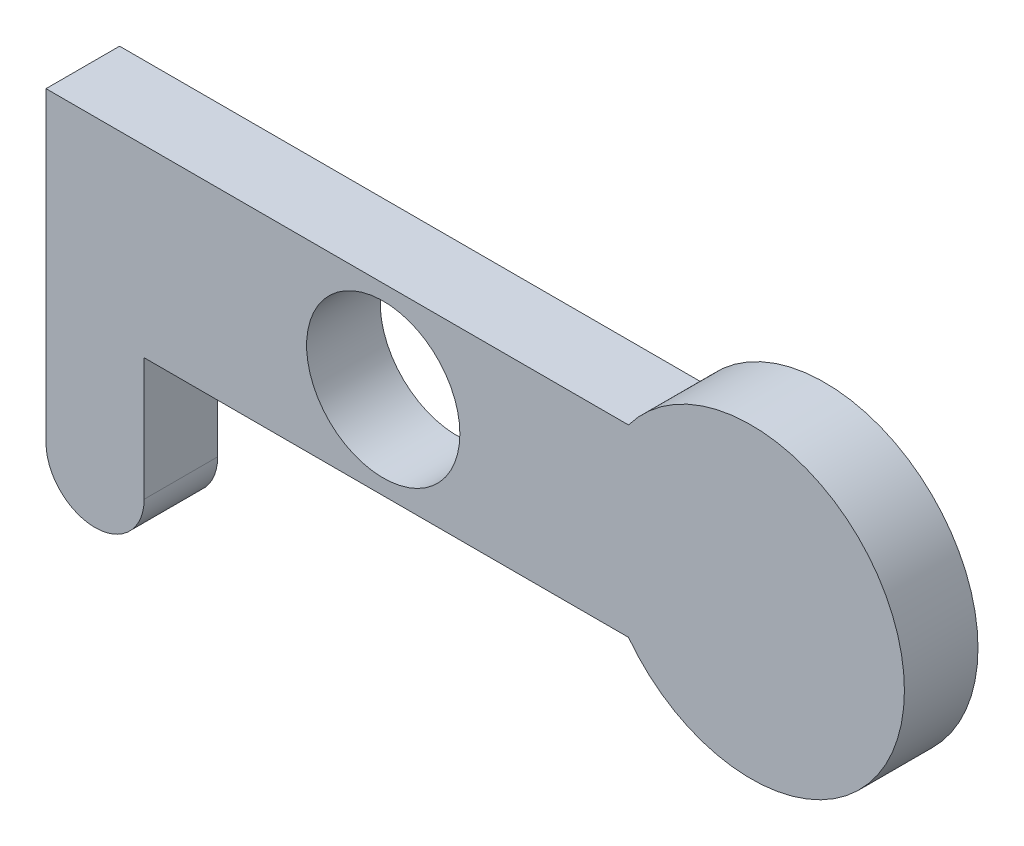
ISO-10303-21;
HEADER;
FILE_DESCRIPTION(('STEP AP214'),'2;1');
FILE_NAME('part.step','',(''),(''),'','','');
FILE_SCHEMA(('AUTOMOTIVE_DESIGN { 1 0 10303 214 1 1 1 1 }'));
ENDSEC;
DATA;
#1=APPLICATION_CONTEXT('core data for automotive mechanical design processes');
#2=APPLICATION_PROTOCOL_DEFINITION('international standard','automotive_design',2000,#1);
#3=PRODUCT_CONTEXT('',#1,'mechanical');
#4=PRODUCT('Part','Part','',(#3));
#5=PRODUCT_RELATED_PRODUCT_CATEGORY('part','',(#4));
#6=PRODUCT_DEFINITION_FORMATION('','',#4);
#7=PRODUCT_DEFINITION_CONTEXT('part definition',#1,'design');
#8=PRODUCT_DEFINITION('design','',#6,#7);
#9=PRODUCT_DEFINITION_SHAPE('','',#8);
#10=(LENGTH_UNIT() NAMED_UNIT(*) SI_UNIT(.MILLI.,.METRE.));
#11=(NAMED_UNIT(*) PLANE_ANGLE_UNIT() SI_UNIT($,.RADIAN.));
#12=(NAMED_UNIT(*) SI_UNIT($,.STERADIAN.) SOLID_ANGLE_UNIT());
#13=UNCERTAINTY_MEASURE_WITH_UNIT(LENGTH_MEASURE(1.E-05),#10,'distance_accuracy_value','');
#14=(GEOMETRIC_REPRESENTATION_CONTEXT(3) GLOBAL_UNCERTAINTY_ASSIGNED_CONTEXT((#13)) GLOBAL_UNIT_ASSIGNED_CONTEXT((#10,
#11,#12)) REPRESENTATION_CONTEXT('',''));
#15=CARTESIAN_POINT('',(0.,0.,0.));
#16=DIRECTION('',(0.,0.,1.));
#17=DIRECTION('',(1.,0.,0.));
#18=AXIS2_PLACEMENT_3D('',#15,#16,#17);
#19=CARTESIAN_POINT('',(30.,7.49999999999999,6.));
#20=DIRECTION('',(0.,0.,1.));
#21=DIRECTION('',(1.,0.,0.));
#22=AXIS2_PLACEMENT_3D('',#19,#20,#21);
#23=PLANE('',#22);
#24=DIRECTION('',(1.,0.,0.));
#25=VECTOR('',#24,1.);
#26=CARTESIAN_POINT('',(0.,0.,6.));
#27=LINE('',#26,#25);
#28=CARTESIAN_POINT('',(-19.5,0.,6.));
#29=VERTEX_POINT('',#28);
#30=CARTESIAN_POINT('',(20.,0.,6.));
#31=VERTEX_POINT('',#30);
#32=EDGE_CURVE('E52',#29,#31,#27,.T.);
#33=ORIENTED_EDGE('',*,*,#32,.T.);
#34=CARTESIAN_POINT('',(30.,7.49999999999999,6.));
#35=DIRECTION('',(0.,0.,1.));
#36=DIRECTION('',(1.,0.,0.));
#37=AXIS2_PLACEMENT_3D('',#34,#35,#36);
#38=CIRCLE('',#37,12.5);
#39=CARTESIAN_POINT('',(20.,15.,6.));
#40=VERTEX_POINT('',#39);
#41=EDGE_CURVE('E90',#31,#40,#38,.T.);
#42=ORIENTED_EDGE('',*,*,#41,.T.);
#43=DIRECTION('',(-1.,0.,0.));
#44=VECTOR('',#43,1.);
#45=CARTESIAN_POINT('',(8.03219598176579,15.,6.));
#46=LINE('',#45,#44);
#47=CARTESIAN_POINT('',(-27.5,15.,6.));
#48=VERTEX_POINT('',#47);
#49=EDGE_CURVE('E104',#40,#48,#46,.T.);
#50=ORIENTED_EDGE('',*,*,#49,.T.);
#51=DIRECTION('',(0.,-1.,0.));
#52=VECTOR('',#51,1.);
#53=CARTESIAN_POINT('',(-27.5,-10.,6.));
#54=LINE('',#53,#52);
#55=CARTESIAN_POINT('',(-27.5,-10.,6.));
#56=VERTEX_POINT('',#55);
#57=EDGE_CURVE('E98',#48,#56,#54,.T.);
#58=ORIENTED_EDGE('',*,*,#57,.T.);
#59=CARTESIAN_POINT('',(-23.5,-10.,6.));
#60=DIRECTION('',(0.,0.,1.));
#61=DIRECTION('',(-1.,0.,0.));
#62=AXIS2_PLACEMENT_3D('',#59,#60,#61);
#63=CIRCLE('',#62,4.);
#64=CARTESIAN_POINT('',(-19.5,-10.,6.));
#65=VERTEX_POINT('',#64);
#66=EDGE_CURVE('E102',#56,#65,#63,.T.);
#67=ORIENTED_EDGE('',*,*,#66,.T.);
#68=DIRECTION('',(0.,1.,0.));
#69=VECTOR('',#68,1.);
#70=CARTESIAN_POINT('',(-19.5,0.,6.));
#71=LINE('',#70,#69);
#72=EDGE_CURVE('E118',#65,#29,#71,.T.);
#73=ORIENTED_EDGE('',*,*,#72,.T.);
#74=EDGE_LOOP('',(#33,#42,#50,#58,#67,#73));
#75=FACE_BOUND('',#74,.T.);
#76=CARTESIAN_POINT('',(0.,7.5,6.));
#77=DIRECTION('',(0.,0.,1.));
#78=DIRECTION('',(1.,0.,0.));
#79=AXIS2_PLACEMENT_3D('',#76,#77,#78);
#80=CIRCLE('',#79,6.25);
#81=CARTESIAN_POINT('',(6.25,7.5,6.));
#82=VERTEX_POINT('',#81);
#83=EDGE_CURVE('E128',#82,#82,#80,.T.);
#84=ORIENTED_EDGE('',*,*,#83,.F.);
#85=EDGE_LOOP('',(#84));
#86=FACE_BOUND('',#85,.T.);
#87=ADVANCED_FACE('F35',(#75,#86),#23,.T.);
#88=CARTESIAN_POINT('',(30.,7.49999999999999,0.));
#89=DIRECTION('',(0.,0.,1.));
#90=DIRECTION('',(1.,0.,0.));
#91=AXIS2_PLACEMENT_3D('',#88,#89,#90);
#92=PLANE('',#91);
#93=CARTESIAN_POINT('',(30.,7.49999999999999,0.));
#94=DIRECTION('',(0.,0.,1.));
#95=DIRECTION('',(1.,0.,0.));
#96=AXIS2_PLACEMENT_3D('',#93,#94,#95);
#97=CIRCLE('',#96,12.5);
#98=CARTESIAN_POINT('',(20.,0.,0.));
#99=VERTEX_POINT('',#98);
#100=CARTESIAN_POINT('',(20.,15.,0.));
#101=VERTEX_POINT('',#100);
#102=EDGE_CURVE('E124',#99,#101,#97,.T.);
#103=ORIENTED_EDGE('',*,*,#102,.F.);
#104=DIRECTION('',(1.,0.,0.));
#105=VECTOR('',#104,1.);
#106=CARTESIAN_POINT('',(0.,0.,0.));
#107=LINE('',#106,#105);
#108=CARTESIAN_POINT('',(-19.5,0.,0.));
#109=VERTEX_POINT('',#108);
#110=EDGE_CURVE('E133',#109,#99,#107,.T.);
#111=ORIENTED_EDGE('',*,*,#110,.F.);
#112=DIRECTION('',(0.,1.,0.));
#113=VECTOR('',#112,1.);
#114=CARTESIAN_POINT('',(-19.5,0.,0.));
#115=LINE('',#114,#113);
#116=CARTESIAN_POINT('',(-19.5,-10.,0.));
#117=VERTEX_POINT('',#116);
#118=EDGE_CURVE('E83',#117,#109,#115,.T.);
#119=ORIENTED_EDGE('',*,*,#118,.F.);
#120=CARTESIAN_POINT('',(-23.5,-10.,0.));
#121=DIRECTION('',(0.,0.,1.));
#122=DIRECTION('',(-1.,0.,0.));
#123=AXIS2_PLACEMENT_3D('',#120,#121,#122);
#124=CIRCLE('',#123,4.);
#125=CARTESIAN_POINT('',(-27.5,-10.,0.));
#126=VERTEX_POINT('',#125);
#127=EDGE_CURVE('E76',#126,#117,#124,.T.);
#128=ORIENTED_EDGE('',*,*,#127,.F.);
#129=DIRECTION('',(0.,-1.,0.));
#130=VECTOR('',#129,1.);
#131=CARTESIAN_POINT('',(-27.5,-10.,0.));
#132=LINE('',#131,#130);
#133=CARTESIAN_POINT('',(-27.5,15.,0.));
#134=VERTEX_POINT('',#133);
#135=EDGE_CURVE('E112',#134,#126,#132,.T.);
#136=ORIENTED_EDGE('',*,*,#135,.F.);
#137=DIRECTION('',(-1.,0.,0.));
#138=VECTOR('',#137,1.);
#139=CARTESIAN_POINT('',(-27.5,15.,0.));
#140=LINE('',#139,#138);
#141=EDGE_CURVE('E127',#101,#134,#140,.T.);
#142=ORIENTED_EDGE('',*,*,#141,.F.);
#143=EDGE_LOOP('',(#103,#111,#119,#128,#136,#142));
#144=FACE_BOUND('',#143,.T.);
#145=CARTESIAN_POINT('',(0.,7.5,0.));
#146=DIRECTION('',(0.,0.,1.));
#147=DIRECTION('',(1.,0.,0.));
#148=AXIS2_PLACEMENT_3D('',#145,#146,#147);
#149=CIRCLE('',#148,6.25);
#150=CARTESIAN_POINT('',(6.25,7.5,0.));
#151=VERTEX_POINT('',#150);
#152=EDGE_CURVE('E150',#151,#151,#149,.T.);
#153=ORIENTED_EDGE('',*,*,#152,.T.);
#154=EDGE_LOOP('',(#153));
#155=FACE_BOUND('',#154,.T.);
#156=ADVANCED_FACE('F143',(#144,#155),#92,.F.);
#157=CARTESIAN_POINT('',(30.,7.49999999999999,6.));
#158=DIRECTION('',(0.,0.,-1.));
#159=DIRECTION('',(-1.,0.,0.));
#160=AXIS2_PLACEMENT_3D('',#157,#158,#159);
#161=CYLINDRICAL_SURFACE('',#160,12.5);
#162=ORIENTED_EDGE('',*,*,#102,.T.);
#163=DIRECTION('',(0.,0.,-1.));
#164=VECTOR('',#163,1.);
#165=CARTESIAN_POINT('',(20.,15.,6.));
#166=LINE('',#165,#164);
#167=EDGE_CURVE('E44',#40,#101,#166,.T.);
#168=ORIENTED_EDGE('',*,*,#167,.F.);
#169=ORIENTED_EDGE('',*,*,#41,.F.);
#170=DIRECTION('',(0.,0.,-1.));
#171=VECTOR('',#170,1.);
#172=CARTESIAN_POINT('',(20.,0.,6.));
#173=LINE('',#172,#171);
#174=EDGE_CURVE('E11',#31,#99,#173,.T.);
#175=ORIENTED_EDGE('',*,*,#174,.T.);
#176=EDGE_LOOP('',(#162,#168,#169,#175));
#177=FACE_BOUND('',#176,.T.);
#178=ADVANCED_FACE('F37',(#177),#161,.T.);
#179=CARTESIAN_POINT('',(-27.5,15.,6.));
#180=DIRECTION('',(0.,-1.,0.));
#181=DIRECTION('',(1.,0.,0.));
#182=AXIS2_PLACEMENT_3D('',#179,#180,#181);
#183=PLANE('',#182);
#184=ORIENTED_EDGE('',*,*,#141,.T.);
#185=DIRECTION('',(0.,0.,-1.));
#186=VECTOR('',#185,1.);
#187=CARTESIAN_POINT('',(-27.5,15.,6.));
#188=LINE('',#187,#186);
#189=EDGE_CURVE('E113',#48,#134,#188,.T.);
#190=ORIENTED_EDGE('',*,*,#189,.F.);
#191=ORIENTED_EDGE('',*,*,#49,.F.);
#192=ORIENTED_EDGE('',*,*,#167,.T.);
#193=EDGE_LOOP('',(#184,#190,#191,#192));
#194=FACE_BOUND('',#193,.T.);
#195=ADVANCED_FACE('F139',(#194),#183,.F.);
#196=CARTESIAN_POINT('',(-27.5,-10.,6.));
#197=DIRECTION('',(1.,0.,0.));
#198=DIRECTION('',(0.,0.,-1.));
#199=AXIS2_PLACEMENT_3D('',#196,#197,#198);
#200=PLANE('',#199);
#201=ORIENTED_EDGE('',*,*,#135,.T.);
#202=DIRECTION('',(0.,0.,-1.));
#203=VECTOR('',#202,1.);
#204=CARTESIAN_POINT('',(-27.5,-10.,6.));
#205=LINE('',#204,#203);
#206=EDGE_CURVE('E109',#56,#126,#205,.T.);
#207=ORIENTED_EDGE('',*,*,#206,.F.);
#208=ORIENTED_EDGE('',*,*,#57,.F.);
#209=ORIENTED_EDGE('',*,*,#189,.T.);
#210=EDGE_LOOP('',(#201,#207,#208,#209));
#211=FACE_BOUND('',#210,.T.);
#212=ADVANCED_FACE('F110',(#211),#200,.F.);
#213=CARTESIAN_POINT('',(-23.5,-10.,6.));
#214=DIRECTION('',(0.,0.,-1.));
#215=DIRECTION('',(-1.,0.,0.));
#216=AXIS2_PLACEMENT_3D('',#213,#214,#215);
#217=CYLINDRICAL_SURFACE('',#216,4.);
#218=ORIENTED_EDGE('',*,*,#127,.T.);
#219=DIRECTION('',(0.,0.,-1.));
#220=VECTOR('',#219,1.);
#221=CARTESIAN_POINT('',(-19.5,-10.,6.));
#222=LINE('',#221,#220);
#223=EDGE_CURVE('E114',#65,#117,#222,.T.);
#224=ORIENTED_EDGE('',*,*,#223,.F.);
#225=ORIENTED_EDGE('',*,*,#66,.F.);
#226=ORIENTED_EDGE('',*,*,#206,.T.);
#227=EDGE_LOOP('',(#218,#224,#225,#226));
#228=FACE_BOUND('',#227,.T.);
#229=ADVANCED_FACE('F116',(#228),#217,.T.);
#230=CARTESIAN_POINT('',(-19.5,0.,6.));
#231=DIRECTION('',(-1.,0.,0.));
#232=DIRECTION('',(0.,-1.,0.));
#233=AXIS2_PLACEMENT_3D('',#230,#231,#232);
#234=PLANE('',#233);
#235=ORIENTED_EDGE('',*,*,#118,.T.);
#236=DIRECTION('',(0.,0.,-1.));
#237=VECTOR('',#236,1.);
#238=CARTESIAN_POINT('',(-19.5,0.,6.));
#239=LINE('',#238,#237);
#240=EDGE_CURVE('E120',#29,#109,#239,.T.);
#241=ORIENTED_EDGE('',*,*,#240,.F.);
#242=ORIENTED_EDGE('',*,*,#72,.F.);
#243=ORIENTED_EDGE('',*,*,#223,.T.);
#244=EDGE_LOOP('',(#235,#241,#242,#243));
#245=FACE_BOUND('',#244,.T.);
#246=ADVANCED_FACE('F146',(#245),#234,.F.);
#247=CARTESIAN_POINT('',(0.,0.,6.));
#248=DIRECTION('',(0.,1.,0.));
#249=DIRECTION('',(-1.,0.,0.));
#250=AXIS2_PLACEMENT_3D('',#247,#248,#249);
#251=PLANE('',#250);
#252=ORIENTED_EDGE('',*,*,#110,.T.);
#253=ORIENTED_EDGE('',*,*,#174,.F.);
#254=ORIENTED_EDGE('',*,*,#32,.F.);
#255=ORIENTED_EDGE('',*,*,#240,.T.);
#256=EDGE_LOOP('',(#252,#253,#254,#255));
#257=FACE_BOUND('',#256,.T.);
#258=ADVANCED_FACE('F145',(#257),#251,.F.);
#259=CARTESIAN_POINT('',(0.,7.5,6.));
#260=DIRECTION('',(0.,0.,-1.));
#261=DIRECTION('',(-1.,0.,0.));
#262=AXIS2_PLACEMENT_3D('',#259,#260,#261);
#263=CYLINDRICAL_SURFACE('',#262,6.25);
#264=ORIENTED_EDGE('',*,*,#83,.T.);
#265=EDGE_LOOP('',(#264));
#266=FACE_BOUND('',#265,.T.);
#267=ORIENTED_EDGE('',*,*,#152,.F.);
#268=EDGE_LOOP('',(#267));
#269=FACE_BOUND('',#268,.T.);
#270=ADVANCED_FACE('F156',(#266,#269),#263,.F.);
#271=CLOSED_SHELL('',(#87,#156,#178,#195,#212,#229,#246,#258,#270));
#272=MANIFOLD_SOLID_BREP('B2',#271);
#273=ADVANCED_BREP_SHAPE_REPRESENTATION('',(#18,#272),#14);
#274=SHAPE_DEFINITION_REPRESENTATION(#9,#273);
ENDSEC;
END-ISO-10303-21;
